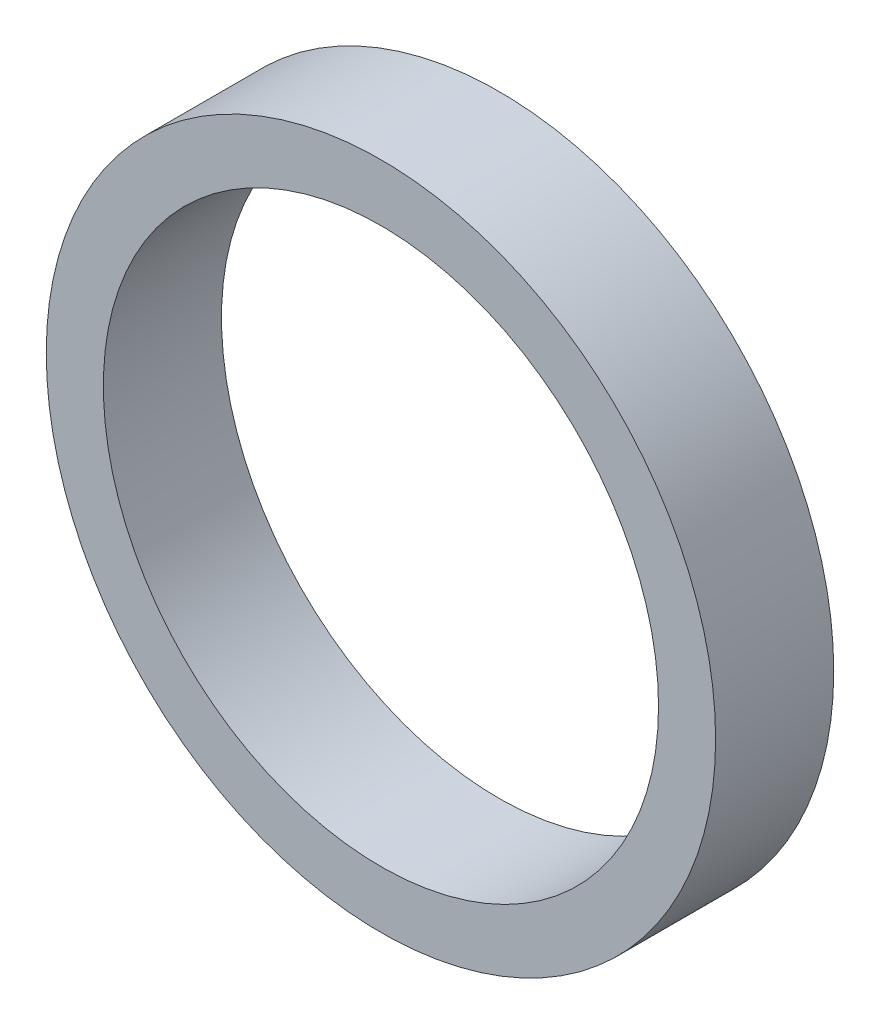
ISO-10303-21;
HEADER;
FILE_DESCRIPTION(('STEP AP214'),'2;1');
FILE_NAME('part.step','',(''),(''),'','','');
FILE_SCHEMA(('AUTOMOTIVE_DESIGN { 1 0 10303 214 1 1 1 1 }'));
ENDSEC;
DATA;
#1=APPLICATION_CONTEXT('core data for automotive mechanical design processes');
#2=APPLICATION_PROTOCOL_DEFINITION('international standard','automotive_design',2000,#1);
#3=PRODUCT_CONTEXT('',#1,'mechanical');
#4=PRODUCT('Part','Part','',(#3));
#5=PRODUCT_RELATED_PRODUCT_CATEGORY('part','',(#4));
#6=PRODUCT_DEFINITION_FORMATION('','',#4);
#7=PRODUCT_DEFINITION_CONTEXT('part definition',#1,'design');
#8=PRODUCT_DEFINITION('design','',#6,#7);
#9=PRODUCT_DEFINITION_SHAPE('','',#8);
#10=(LENGTH_UNIT() NAMED_UNIT(*) SI_UNIT(.MILLI.,.METRE.));
#11=(NAMED_UNIT(*) PLANE_ANGLE_UNIT() SI_UNIT($,.RADIAN.));
#12=(NAMED_UNIT(*) SI_UNIT($,.STERADIAN.) SOLID_ANGLE_UNIT());
#13=UNCERTAINTY_MEASURE_WITH_UNIT(LENGTH_MEASURE(1.E-05),#10,'distance_accuracy_value','');
#14=(GEOMETRIC_REPRESENTATION_CONTEXT(3) GLOBAL_UNCERTAINTY_ASSIGNED_CONTEXT((#13)) GLOBAL_UNIT_ASSIGNED_CONTEXT((#10,
#11,#12)) REPRESENTATION_CONTEXT('',''));
#15=CARTESIAN_POINT('',(0.,0.,0.));
#16=DIRECTION('',(0.,0.,1.));
#17=DIRECTION('',(1.,0.,0.));
#18=AXIS2_PLACEMENT_3D('',#15,#16,#17);
#19=CARTESIAN_POINT('',(0.,0.,7.62));
#20=DIRECTION('',(0.,0.,-1.));
#21=DIRECTION('',(-1.,0.,0.));
#22=AXIS2_PLACEMENT_3D('',#19,#20,#21);
#23=CYLINDRICAL_SURFACE('',#22,21.59);
#24=CARTESIAN_POINT('',(0.,0.,7.62));
#25=DIRECTION('',(0.,0.,1.));
#26=DIRECTION('',(1.,0.,0.));
#27=AXIS2_PLACEMENT_3D('',#24,#25,#26);
#28=CIRCLE('',#27,21.59);
#29=CARTESIAN_POINT('',(-21.59,0.,7.62));
#30=VERTEX_POINT('',#29);
#31=EDGE_CURVE('E10',#30,#30,#28,.T.);
#32=CARTESIAN_POINT('',(0.,0.,0.));
#33=DIRECTION('',(0.,0.,1.));
#34=DIRECTION('',(1.,0.,0.));
#35=AXIS2_PLACEMENT_3D('',#32,#33,#34);
#36=CIRCLE('',#35,21.59);
#37=CARTESIAN_POINT('',(-21.59,0.,0.));
#38=VERTEX_POINT('',#37);
#39=EDGE_CURVE('E42',#38,#38,#36,.T.);
#40=CARTESIAN_POINT('',(-21.59,0.,7.62));
#41=CARTESIAN_POINT('',(-21.59,0.,7.540625));
#42=CARTESIAN_POINT('',(-21.59,0.,7.46125));
#43=CARTESIAN_POINT('',(-21.59,0.,7.3025));
#44=CARTESIAN_POINT('',(-21.59,0.,7.223125));
#45=CARTESIAN_POINT('',(-21.59,0.,7.064375));
#46=CARTESIAN_POINT('',(-21.59,0.,6.985));
#47=CARTESIAN_POINT('',(-21.59,0.,6.82625));
#48=CARTESIAN_POINT('',(-21.59,0.,6.746875));
#49=CARTESIAN_POINT('',(-21.59,0.,6.588125));
#50=CARTESIAN_POINT('',(-21.59,0.,6.50875));
#51=CARTESIAN_POINT('',(-21.59,0.,6.35));
#52=CARTESIAN_POINT('',(-21.59,0.,6.270625));
#53=CARTESIAN_POINT('',(-21.59,0.,6.111875));
#54=CARTESIAN_POINT('',(-21.59,0.,6.0325));
#55=CARTESIAN_POINT('',(-21.59,0.,5.87375));
#56=CARTESIAN_POINT('',(-21.59,0.,5.794375));
#57=CARTESIAN_POINT('',(-21.59,0.,5.635625));
#58=CARTESIAN_POINT('',(-21.59,0.,5.55625));
#59=CARTESIAN_POINT('',(-21.59,0.,5.3975));
#60=CARTESIAN_POINT('',(-21.59,0.,5.318125));
#61=CARTESIAN_POINT('',(-21.59,0.,5.159375));
#62=CARTESIAN_POINT('',(-21.59,0.,5.08));
#63=CARTESIAN_POINT('',(-21.59,0.,4.92125));
#64=CARTESIAN_POINT('',(-21.59,0.,4.841875));
#65=CARTESIAN_POINT('',(-21.59,0.,4.683125));
#66=CARTESIAN_POINT('',(-21.59,0.,4.60375));
#67=CARTESIAN_POINT('',(-21.59,0.,4.445));
#68=CARTESIAN_POINT('',(-21.59,0.,4.365625));
#69=CARTESIAN_POINT('',(-21.59,0.,4.206875));
#70=CARTESIAN_POINT('',(-21.59,0.,4.1275));
#71=CARTESIAN_POINT('',(-21.59,0.,3.96875));
#72=CARTESIAN_POINT('',(-21.59,0.,3.889375));
#73=CARTESIAN_POINT('',(-21.59,0.,3.730625));
#74=CARTESIAN_POINT('',(-21.59,0.,3.65125));
#75=CARTESIAN_POINT('',(-21.59,0.,3.4925));
#76=CARTESIAN_POINT('',(-21.59,0.,3.413125));
#77=CARTESIAN_POINT('',(-21.59,0.,3.254375));
#78=CARTESIAN_POINT('',(-21.59,0.,3.175));
#79=CARTESIAN_POINT('',(-21.59,0.,3.01625));
#80=CARTESIAN_POINT('',(-21.59,0.,2.936875));
#81=CARTESIAN_POINT('',(-21.59,0.,2.778125));
#82=CARTESIAN_POINT('',(-21.59,0.,2.69875));
#83=CARTESIAN_POINT('',(-21.59,0.,2.54));
#84=CARTESIAN_POINT('',(-21.59,0.,2.460625));
#85=CARTESIAN_POINT('',(-21.59,0.,2.301875));
#86=CARTESIAN_POINT('',(-21.59,0.,2.2225));
#87=CARTESIAN_POINT('',(-21.59,0.,2.06375));
#88=CARTESIAN_POINT('',(-21.59,0.,1.984375));
#89=CARTESIAN_POINT('',(-21.59,0.,1.825625));
#90=CARTESIAN_POINT('',(-21.59,0.,1.74625));
#91=CARTESIAN_POINT('',(-21.59,0.,1.5875));
#92=CARTESIAN_POINT('',(-21.59,0.,1.508125));
#93=CARTESIAN_POINT('',(-21.59,0.,1.349375));
#94=CARTESIAN_POINT('',(-21.59,0.,1.27));
#95=CARTESIAN_POINT('',(-21.59,0.,1.11125));
#96=CARTESIAN_POINT('',(-21.59,0.,1.031875));
#97=CARTESIAN_POINT('',(-21.59,0.,0.873125));
#98=CARTESIAN_POINT('',(-21.59,0.,0.79375));
#99=CARTESIAN_POINT('',(-21.59,0.,0.635));
#100=CARTESIAN_POINT('',(-21.59,0.,0.555625));
#101=CARTESIAN_POINT('',(-21.59,0.,0.396875));
#102=CARTESIAN_POINT('',(-21.59,0.,0.3175));
#103=CARTESIAN_POINT('',(-21.59,0.,0.15875));
#104=CARTESIAN_POINT('',(-21.59,0.,0.0793749999999999));
#105=CARTESIAN_POINT('',(-21.59,0.,0.));
#106=B_SPLINE_CURVE_WITH_KNOTS('',3,(#40,#41,#42,#43,#44,#45,#46,#47,#48,#49,#50,#51,#52,#53,
#54,#55,#56,#57,#58,#59,#60,#61,#62,#63,#64,#65,#66,#67,#68,#69,#70,#71,#72,#73,#74,#75,#76,#77,
#78,#79,#80,#81,#82,#83,#84,#85,#86,#87,#88,#89,#90,#91,#92,#93,#94,#95,#96,#97,#98,#99,#100,
#101,#102,#103,#104,#105),.UNSPECIFIED.,.F.,.F.,(4,2,2,2,2,2,2,2,2,2,2,2,2,2,2,2,2,2,2,2,2,2,2,
2,2,2,2,2,2,2,2,2,4),(0.,0.238125,0.476249999999999,0.714375,0.952499999999999,1.190625,1.42875,
1.666875,1.905,2.143125,2.38125,2.619375,2.8575,3.095625,3.33375,3.571875,3.81,4.048125,4.28625,
4.524375,4.7625,5.000625,5.23875,5.476875,5.715,5.953125,6.19125,6.429375,6.6675,6.905625,
7.14375,7.381875,7.62),.UNSPECIFIED.);
#107=EDGE_CURVE('BSEAM39',#30,#38,#106,.T.);
#108=ORIENTED_EDGE('',*,*,#31,.F.);
#109=ORIENTED_EDGE('',*,*,#39,.T.);
#110=ORIENTED_EDGE('',*,*,#107,.T.);
#111=ORIENTED_EDGE('',*,*,#107,.F.);
#112=EDGE_LOOP('',(#108,#110,#109,#111));
#113=FACE_BOUND('',#112,.T.);
#114=ADVANCED_FACE('F39',(#113),#23,.T.);
#115=CARTESIAN_POINT('',(0.,0.,7.62));
#116=DIRECTION('',(0.,0.,1.));
#117=DIRECTION('',(1.,0.,0.));
#118=AXIS2_PLACEMENT_3D('',#115,#116,#117);
#119=PLANE('',#118);
#120=CARTESIAN_POINT('',(0.,0.,7.62));
#121=DIRECTION('',(0.,0.,1.));
#122=DIRECTION('',(1.,0.,0.));
#123=AXIS2_PLACEMENT_3D('',#120,#121,#122);
#124=CIRCLE('',#123,17.907);
#125=CARTESIAN_POINT('',(17.907,0.,7.62));
#126=VERTEX_POINT('',#125);
#127=EDGE_CURVE('E53',#126,#126,#124,.T.);
#128=ORIENTED_EDGE('',*,*,#127,.F.);
#129=EDGE_LOOP('',(#128));
#130=FACE_BOUND('',#129,.T.);
#131=ORIENTED_EDGE('',*,*,#31,.T.);
#132=EDGE_LOOP('',(#131));
#133=FACE_BOUND('',#132,.T.);
#134=ADVANCED_FACE('F70',(#130,#133),#119,.T.);
#135=CARTESIAN_POINT('',(0.,0.,0.));
#136=DIRECTION('',(0.,0.,1.));
#137=DIRECTION('',(1.,0.,0.));
#138=AXIS2_PLACEMENT_3D('',#135,#136,#137);
#139=PLANE('',#138);
#140=CARTESIAN_POINT('',(0.,0.,0.));
#141=DIRECTION('',(0.,0.,1.));
#142=DIRECTION('',(1.,0.,0.));
#143=AXIS2_PLACEMENT_3D('',#140,#141,#142);
#144=CIRCLE('',#143,17.907);
#145=CARTESIAN_POINT('',(17.907,0.,0.));
#146=VERTEX_POINT('',#145);
#147=EDGE_CURVE('E51',#146,#146,#144,.T.);
#148=ORIENTED_EDGE('',*,*,#147,.T.);
#149=EDGE_LOOP('',(#148));
#150=FACE_BOUND('',#149,.T.);
#151=ORIENTED_EDGE('',*,*,#39,.F.);
#152=EDGE_LOOP('',(#151));
#153=FACE_BOUND('',#152,.T.);
#154=ADVANCED_FACE('F61',(#150,#153),#139,.F.);
#155=CARTESIAN_POINT('',(0.,0.,0.));
#156=DIRECTION('',(0.,0.,1.));
#157=DIRECTION('',(1.,0.,0.));
#158=AXIS2_PLACEMENT_3D('',#155,#156,#157);
#159=CYLINDRICAL_SURFACE('',#158,17.907);
#160=CARTESIAN_POINT('',(17.907,0.,0.));
#161=CARTESIAN_POINT('',(17.907,0.,0.0793749999999998));
#162=CARTESIAN_POINT('',(17.907,0.,0.15875));
#163=CARTESIAN_POINT('',(17.907,0.,0.3175));
#164=CARTESIAN_POINT('',(17.907,0.,0.396875));
#165=CARTESIAN_POINT('',(17.907,0.,0.555625));
#166=CARTESIAN_POINT('',(17.907,0.,0.635));
#167=CARTESIAN_POINT('',(17.907,0.,0.79375));
#168=CARTESIAN_POINT('',(17.907,0.,0.873125));
#169=CARTESIAN_POINT('',(17.907,0.,1.031875));
#170=CARTESIAN_POINT('',(17.907,0.,1.11125));
#171=CARTESIAN_POINT('',(17.907,0.,1.27));
#172=CARTESIAN_POINT('',(17.907,0.,1.349375));
#173=CARTESIAN_POINT('',(17.907,0.,1.508125));
#174=CARTESIAN_POINT('',(17.907,0.,1.5875));
#175=CARTESIAN_POINT('',(17.907,0.,1.74625));
#176=CARTESIAN_POINT('',(17.907,0.,1.825625));
#177=CARTESIAN_POINT('',(17.907,0.,1.984375));
#178=CARTESIAN_POINT('',(17.907,0.,2.06375));
#179=CARTESIAN_POINT('',(17.907,0.,2.2225));
#180=CARTESIAN_POINT('',(17.907,0.,2.301875));
#181=CARTESIAN_POINT('',(17.907,0.,2.460625));
#182=CARTESIAN_POINT('',(17.907,0.,2.54));
#183=CARTESIAN_POINT('',(17.907,0.,2.69875));
#184=CARTESIAN_POINT('',(17.907,0.,2.778125));
#185=CARTESIAN_POINT('',(17.907,0.,2.936875));
#186=CARTESIAN_POINT('',(17.907,0.,3.01625));
#187=CARTESIAN_POINT('',(17.907,0.,3.175));
#188=CARTESIAN_POINT('',(17.907,0.,3.254375));
#189=CARTESIAN_POINT('',(17.907,0.,3.413125));
#190=CARTESIAN_POINT('',(17.907,0.,3.4925));
#191=CARTESIAN_POINT('',(17.907,0.,3.65125));
#192=CARTESIAN_POINT('',(17.907,0.,3.730625));
#193=CARTESIAN_POINT('',(17.907,0.,3.889375));
#194=CARTESIAN_POINT('',(17.907,0.,3.96875));
#195=CARTESIAN_POINT('',(17.907,0.,4.1275));
#196=CARTESIAN_POINT('',(17.907,0.,4.206875));
#197=CARTESIAN_POINT('',(17.907,0.,4.365625));
#198=CARTESIAN_POINT('',(17.907,0.,4.445));
#199=CARTESIAN_POINT('',(17.907,0.,4.60375));
#200=CARTESIAN_POINT('',(17.907,0.,4.683125));
#201=CARTESIAN_POINT('',(17.907,0.,4.841875));
#202=CARTESIAN_POINT('',(17.907,0.,4.92125));
#203=CARTESIAN_POINT('',(17.907,0.,5.08));
#204=CARTESIAN_POINT('',(17.907,0.,5.159375));
#205=CARTESIAN_POINT('',(17.907,0.,5.318125));
#206=CARTESIAN_POINT('',(17.907,0.,5.3975));
#207=CARTESIAN_POINT('',(17.907,0.,5.55625));
#208=CARTESIAN_POINT('',(17.907,0.,5.635625));
#209=CARTESIAN_POINT('',(17.907,0.,5.794375));
#210=CARTESIAN_POINT('',(17.907,0.,5.87375));
#211=CARTESIAN_POINT('',(17.907,0.,6.0325));
#212=CARTESIAN_POINT('',(17.907,0.,6.111875));
#213=CARTESIAN_POINT('',(17.907,0.,6.270625));
#214=CARTESIAN_POINT('',(17.907,0.,6.35));
#215=CARTESIAN_POINT('',(17.907,0.,6.50875));
#216=CARTESIAN_POINT('',(17.907,0.,6.588125));
#217=CARTESIAN_POINT('',(17.907,0.,6.746875));
#218=CARTESIAN_POINT('',(17.907,0.,6.82625));
#219=CARTESIAN_POINT('',(17.907,0.,6.985));
#220=CARTESIAN_POINT('',(17.907,0.,7.064375));
#221=CARTESIAN_POINT('',(17.907,0.,7.223125));
#222=CARTESIAN_POINT('',(17.907,0.,7.3025));
#223=CARTESIAN_POINT('',(17.907,0.,7.46125));
#224=CARTESIAN_POINT('',(17.907,0.,7.540625));
#225=CARTESIAN_POINT('',(17.907,0.,7.62));
#226=B_SPLINE_CURVE_WITH_KNOTS('',3,(#160,#161,#162,#163,#164,#165,#166,#167,#168,#169,#170,
#171,#172,#173,#174,#175,#176,#177,#178,#179,#180,#181,#182,#183,#184,#185,#186,#187,#188,#189,
#190,#191,#192,#193,#194,#195,#196,#197,#198,#199,#200,#201,#202,#203,#204,#205,#206,#207,#208,
#209,#210,#211,#212,#213,#214,#215,#216,#217,#218,#219,#220,#221,#222,#223,#224,#225),
.UNSPECIFIED.,.F.,.F.,(4,2,2,2,2,2,2,2,2,2,2,2,2,2,2,2,2,2,2,2,2,2,2,2,2,2,2,2,2,2,2,2,4),(0.,
0.238125,0.47625,0.714375,0.9525,1.190625,1.42875,1.666875,1.905,2.143125,2.38125,2.619375,
2.8575,3.095625,3.33375,3.571875,3.81,4.048125,4.28625,4.524375,4.7625,5.000625,5.23875,
5.476875,5.715,5.953125,6.19125,6.429375,6.6675,6.905625,7.14375,7.381875,7.62),.UNSPECIFIED.);
#227=EDGE_CURVE('BSEAM64',#146,#126,#226,.T.);
#228=ORIENTED_EDGE('',*,*,#147,.F.);
#229=ORIENTED_EDGE('',*,*,#127,.T.);
#230=ORIENTED_EDGE('',*,*,#227,.T.);
#231=ORIENTED_EDGE('',*,*,#227,.F.);
#232=EDGE_LOOP('',(#228,#230,#229,#231));
#233=FACE_BOUND('',#232,.T.);
#234=ADVANCED_FACE('F64',(#233),#159,.F.);
#235=CLOSED_SHELL('',(#114,#134,#154,#234));
#236=MANIFOLD_SOLID_BREP('B2',#235);
#237=ADVANCED_BREP_SHAPE_REPRESENTATION('',(#18,#236),#14);
#238=SHAPE_DEFINITION_REPRESENTATION(#9,#237);
ENDSEC;
END-ISO-10303-21;
